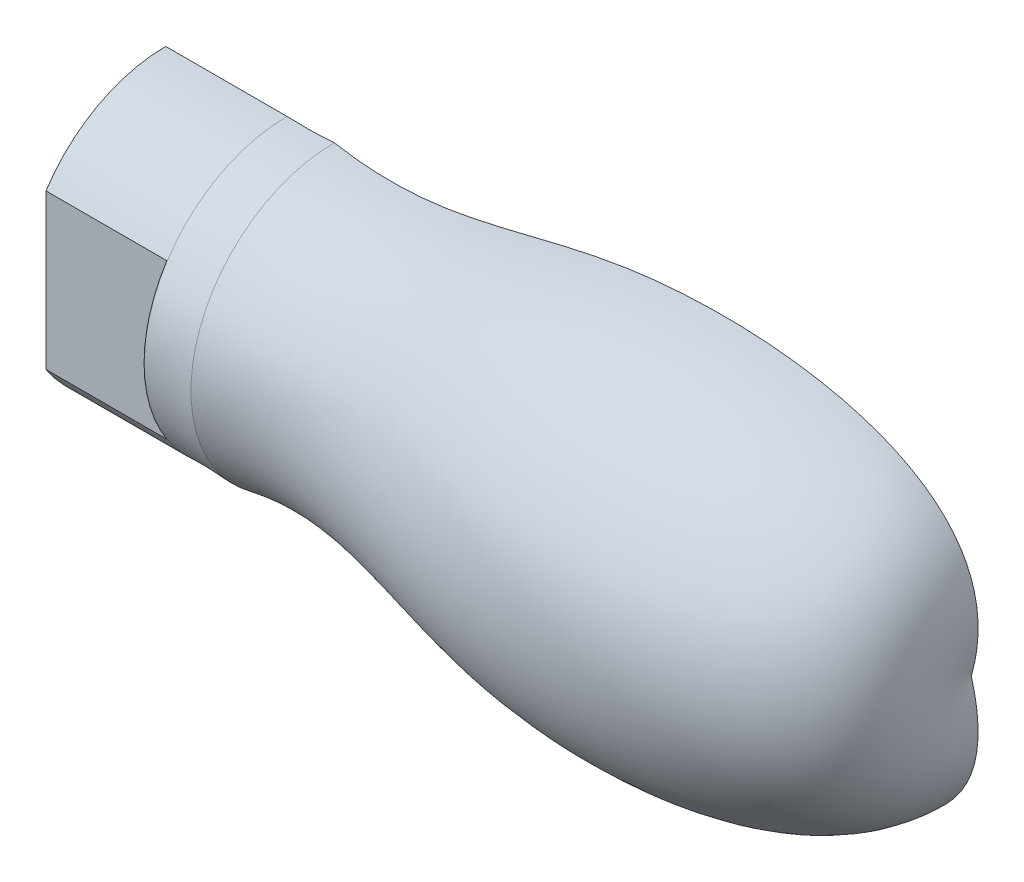
ISO-10303-21;
HEADER;
FILE_DESCRIPTION(('STEP AP214'),'2;1');
FILE_NAME('part.step','',(''),(''),'','','');
FILE_SCHEMA(('AUTOMOTIVE_DESIGN { 1 0 10303 214 1 1 1 1 }'));
ENDSEC;
DATA;
#1=APPLICATION_CONTEXT('core data for automotive mechanical design processes');
#2=APPLICATION_PROTOCOL_DEFINITION('international standard','automotive_design',2000,#1);
#3=PRODUCT_CONTEXT('',#1,'mechanical');
#4=PRODUCT('Part','Part','',(#3));
#5=PRODUCT_RELATED_PRODUCT_CATEGORY('part','',(#4));
#6=PRODUCT_DEFINITION_FORMATION('','',#4);
#7=PRODUCT_DEFINITION_CONTEXT('part definition',#1,'design');
#8=PRODUCT_DEFINITION('design','',#6,#7);
#9=PRODUCT_DEFINITION_SHAPE('','',#8);
#10=(LENGTH_UNIT() NAMED_UNIT(*) SI_UNIT(.MILLI.,.METRE.));
#11=(NAMED_UNIT(*) PLANE_ANGLE_UNIT() SI_UNIT($,.RADIAN.));
#12=(NAMED_UNIT(*) SI_UNIT($,.STERADIAN.) SOLID_ANGLE_UNIT());
#13=UNCERTAINTY_MEASURE_WITH_UNIT(LENGTH_MEASURE(1.E-05),#10,'distance_accuracy_value','');
#14=(GEOMETRIC_REPRESENTATION_CONTEXT(3) GLOBAL_UNCERTAINTY_ASSIGNED_CONTEXT((#13)) GLOBAL_UNIT_ASSIGNED_CONTEXT((#10,
#11,#12)) REPRESENTATION_CONTEXT('',''));
#15=CARTESIAN_POINT('',(0.,0.,0.));
#16=DIRECTION('',(0.,0.,1.));
#17=DIRECTION('',(1.,0.,0.));
#18=AXIS2_PLACEMENT_3D('',#15,#16,#17);
#19=CARTESIAN_POINT('',(-0.0219371371269837,-0.0222773179981183,-0.0199999995529652));
#20=CARTESIAN_POINT('',(-0.0181835933509417,-0.0221070063690019,-0.0199999995529652));
#21=CARTESIAN_POINT('',(-0.0145440964927969,-0.0224081073792718,-0.0199999995529652));
#22=B_SPLINE_CURVE_WITH_KNOTS('',2,(#19,#20,#21),.UNSPECIFIED.,.F.,.F.,(3,3),(0.,
0.0744065206796112),.UNSPECIFIED.);
#23=CARTESIAN_POINT('',(-0.0408828464639241,0.,-0.0199999995529652));
#24=DIRECTION('',(-1.,0.,0.));
#25=AXIS1_PLACEMENT('',#23,#24);
#26=SURFACE_OF_REVOLUTION('',#22,#25);
#27=CARTESIAN_POINT('',(-0.0145440964927969,0.,-0.0199999995529652));
#28=DIRECTION('',(-1.,0.,0.));
#29=DIRECTION('',(0.,0.,1.));
#30=AXIS2_PLACEMENT_3D('',#27,#28,#29);
#31=CIRCLE('',#30,0.0224081073792718);
#32=CARTESIAN_POINT('',(-0.0145440964927969,-0.0224081073792718,-0.0199999995529652));
#33=VERTEX_POINT('',#32);
#34=CARTESIAN_POINT('',(-0.0145440964927969,0.0224081073792718,-0.0199999995529652));
#35=VERTEX_POINT('',#34);
#36=EDGE_CURVE('E95',#33,#35,#31,.T.);
#37=ORIENTED_EDGE('',*,*,#36,.T.);
#38=CARTESIAN_POINT('',(-0.0219371371269837,0.0222773179981183,-0.0199999995529652));
#39=CARTESIAN_POINT('',(-0.0181835933509417,0.0221070063690019,-0.0199999995529652));
#40=CARTESIAN_POINT('',(-0.0145440964927969,0.0224081073792718,-0.0199999995529652));
#41=B_SPLINE_CURVE_WITH_KNOTS('',2,(#38,#39,#40),.UNSPECIFIED.,.F.,.F.,(3,3),(0.,
0.0744065206796112),.UNSPECIFIED.);
#42=CARTESIAN_POINT('',(-0.0219371371269837,0.0222773179981183,-0.0199999995529652));
#43=VERTEX_POINT('',#42);
#44=EDGE_CURVE('E161',#43,#35,#41,.T.);
#45=ORIENTED_EDGE('',*,*,#44,.F.);
#46=CARTESIAN_POINT('',(-0.0219371371269837,0.,-0.0199999995529652));
#47=DIRECTION('',(-1.,0.,0.));
#48=DIRECTION('',(0.,0.,1.));
#49=AXIS2_PLACEMENT_3D('',#46,#47,#48);
#50=CIRCLE('',#49,0.0222773179981183);
#51=CARTESIAN_POINT('',(-0.0219371371269837,-0.0222773179981183,-0.0199999995529652));
#52=VERTEX_POINT('',#51);
#53=EDGE_CURVE('E62',#52,#43,#50,.T.);
#54=ORIENTED_EDGE('',*,*,#53,.F.);
#55=EDGE_CURVE('E131',#52,#33,#22,.T.);
#56=ORIENTED_EDGE('',*,*,#55,.T.);
#57=EDGE_LOOP('',(#37,#45,#54,#56));
#58=FACE_BOUND('',#57,.T.);
#59=ADVANCED_FACE('F39',(#58),#26,.F.);
#60=CARTESIAN_POINT('',(-0.0145440964927969,-0.0224081073792718,-0.0199999995529652));
#61=CARTESIAN_POINT('',(0.00247091074699529,-0.0193367149228004,-0.0199999995529652));
#62=CARTESIAN_POINT('',(0.0322886425798856,-0.0355059717333231,-0.0199999995529653));
#63=CARTESIAN_POINT('',(0.0927020413644303,-0.0268647789069709,-0.0199999995529653));
#64=CARTESIAN_POINT('',(0.0849876443539925,0.,-0.0199999995529652));
#65=B_SPLINE_CURVE_WITH_KNOTS('',3,(#60,#61,#62,#63,#64),.UNSPECIFIED.,.F.,.F.,(4,1,4),(0.,
0.406683359526598,1.),.UNSPECIFIED.);
#66=CARTESIAN_POINT('',(-0.0408828464639241,0.,-0.0199999995529652));
#67=DIRECTION('',(-1.,0.,0.));
#68=AXIS1_PLACEMENT('',#66,#67);
#69=SURFACE_OF_REVOLUTION('',#65,#68);
#70=CARTESIAN_POINT('',(-0.0145440964927969,0.0224081073792718,-0.0199999995529652));
#71=CARTESIAN_POINT('',(0.00247091074699529,0.0193367149228004,-0.0199999995529652));
#72=CARTESIAN_POINT('',(0.0322886425798856,0.0355059717333231,-0.0199999995529653));
#73=CARTESIAN_POINT('',(0.0927020413644303,0.0268647789069709,-0.0199999995529653));
#74=CARTESIAN_POINT('',(0.0849876443539925,0.,-0.0199999995529652));
#75=B_SPLINE_CURVE_WITH_KNOTS('',3,(#70,#71,#72,#73,#74),.UNSPECIFIED.,.F.,.F.,(4,1,4),(0.,
0.406683359526598,1.),.UNSPECIFIED.);
#76=CARTESIAN_POINT('',(0.0849876443539925,0.,-0.0199999995529652));
#77=VERTEX_POINT('',#76);
#78=EDGE_CURVE('E165',#35,#77,#75,.T.);
#79=ORIENTED_EDGE('',*,*,#78,.F.);
#80=ORIENTED_EDGE('',*,*,#36,.F.);
#81=EDGE_CURVE('E124',#33,#77,#65,.T.);
#82=ORIENTED_EDGE('',*,*,#81,.T.);
#83=EDGE_LOOP('',(#79,#80,#82));
#84=FACE_BOUND('',#83,.T.);
#85=ADVANCED_FACE('F41',(#84),#69,.F.);
#86=CARTESIAN_POINT('',(-0.0408828464639241,-0.0222773179981183,-0.0199999995529652));
#87=DIRECTION('',(-1.,0.,0.));
#88=DIRECTION('',(0.,0.,1.));
#89=AXIS2_PLACEMENT_3D('',#86,#87,#88);
#90=PLANE('',#89);
#91=DIRECTION('',(0.,-1.,0.));
#92=VECTOR('',#91,1.);
#93=CARTESIAN_POINT('',(-0.0408828464639241,-0.0222773179981183,-0.00128299731931941));
#94=LINE('',#93,#92);
#95=CARTESIAN_POINT('',(-0.0408828464639241,0.0120810895442003,-0.00128299731931941));
#96=VERTEX_POINT('',#95);
#97=CARTESIAN_POINT('',(-0.0408828464639241,-0.0120810895442003,-0.00128299731931941));
#98=VERTEX_POINT('',#97);
#99=EDGE_CURVE('E101',#96,#98,#94,.T.);
#100=ORIENTED_EDGE('',*,*,#99,.F.);
#101=CARTESIAN_POINT('',(-0.0408828464639241,0.,-0.0199999995529652));
#102=DIRECTION('',(-1.,0.,0.));
#103=DIRECTION('',(0.,0.,1.));
#104=AXIS2_PLACEMENT_3D('',#101,#102,#103);
#105=CIRCLE('',#104,0.0222773179981183);
#106=CARTESIAN_POINT('',(-0.0408828464639241,0.0222773179981183,-0.0199999995529652));
#107=VERTEX_POINT('',#106);
#108=EDGE_CURVE('E106',#96,#107,#105,.T.);
#109=ORIENTED_EDGE('',*,*,#108,.T.);
#110=DIRECTION('',(0.,-1.,0.));
#111=VECTOR('',#110,1.);
#112=CARTESIAN_POINT('',(-0.0408828464639241,-0.0222773179981183,-0.0199999995529652));
#113=LINE('',#112,#111);
#114=CARTESIAN_POINT('',(-0.0408828464639241,-0.0222773179981183,-0.0199999995529652));
#115=VERTEX_POINT('',#114);
#116=EDGE_CURVE('E121',#107,#115,#113,.T.);
#117=ORIENTED_EDGE('',*,*,#116,.T.);
#118=EDGE_CURVE('E111',#115,#98,#105,.T.);
#119=ORIENTED_EDGE('',*,*,#118,.T.);
#120=EDGE_LOOP('',(#100,#109,#117,#119));
#121=FACE_BOUND('',#120,.T.);
#122=ADVANCED_FACE('F152',(#121),#90,.T.);
#123=CARTESIAN_POINT('',(-0.0408828464639241,0.,-0.0199999995529652));
#124=DIRECTION('',(-1.,0.,0.));
#125=DIRECTION('',(0.,0.,1.));
#126=AXIS2_PLACEMENT_3D('',#123,#124,#125);
#127=CYLINDRICAL_SURFACE('',#126,0.0222773179981183);
#128=DIRECTION('',(-1.,0.,0.));
#129=VECTOR('',#128,1.);
#130=CARTESIAN_POINT('',(-0.0408828464639241,-0.0120810895442003,-0.00128299731931941));
#131=LINE('',#130,#129);
#132=CARTESIAN_POINT('',(-0.022,-0.0120810895442003,-0.00128299731931941));
#133=VERTEX_POINT('',#132);
#134=EDGE_CURVE('E11',#98,#133,#131,.F.);
#135=ORIENTED_EDGE('',*,*,#134,.F.);
#136=ORIENTED_EDGE('',*,*,#118,.F.);
#137=DIRECTION('',(1.,0.,0.));
#138=VECTOR('',#137,1.);
#139=CARTESIAN_POINT('',(-0.0408828464639241,-0.0222773179981183,-0.0199999995529652));
#140=LINE('',#139,#138);
#141=EDGE_CURVE('E117',#115,#52,#140,.T.);
#142=ORIENTED_EDGE('',*,*,#141,.T.);
#143=ORIENTED_EDGE('',*,*,#53,.T.);
#144=DIRECTION('',(1.,0.,0.));
#145=VECTOR('',#144,1.);
#146=CARTESIAN_POINT('',(-0.0408828464639241,0.0222773179981183,-0.0199999995529652));
#147=LINE('',#146,#145);
#148=EDGE_CURVE('E140',#107,#43,#147,.T.);
#149=ORIENTED_EDGE('',*,*,#148,.F.);
#150=ORIENTED_EDGE('',*,*,#108,.F.);
#151=DIRECTION('',(-1.,0.,0.));
#152=VECTOR('',#151,1.);
#153=CARTESIAN_POINT('',(-0.0408828464639241,0.0120810895442003,-0.00128299731931941));
#154=LINE('',#153,#152);
#155=CARTESIAN_POINT('',(-0.022,0.0120810895442003,-0.00128299731931941));
#156=VERTEX_POINT('',#155);
#157=EDGE_CURVE('E49',#156,#96,#154,.T.);
#158=ORIENTED_EDGE('',*,*,#157,.F.);
#159=CARTESIAN_POINT('',(-0.022,0.,-0.0199999995529652));
#160=DIRECTION('',(1.,0.,0.));
#161=DIRECTION('',(0.,0.,-1.));
#162=AXIS2_PLACEMENT_3D('',#159,#160,#161);
#163=CIRCLE('',#162,0.0222773179981183);
#164=EDGE_CURVE('E89',#133,#156,#163,.F.);
#165=ORIENTED_EDGE('',*,*,#164,.F.);
#166=EDGE_LOOP('',(#135,#136,#142,#143,#149,#150,#158,#165));
#167=FACE_BOUND('',#166,.T.);
#168=ADVANCED_FACE('F104',(#167),#127,.T.);
#169=CARTESIAN_POINT('',(-0.018212105080416,-0.0222248595288485,-0.0199999995529652));
#170=DIRECTION('',(0.,0.,1.));
#171=DIRECTION('',(0.,-1.,0.));
#172=AXIS2_PLACEMENT_3D('',#169,#170,#171);
#173=PLANE('',#172);
#174=ORIENTED_EDGE('',*,*,#55,.F.);
#175=ORIENTED_EDGE('',*,*,#141,.F.);
#176=ORIENTED_EDGE('',*,*,#116,.F.);
#177=ORIENTED_EDGE('',*,*,#148,.T.);
#178=ORIENTED_EDGE('',*,*,#44,.T.);
#179=ORIENTED_EDGE('',*,*,#78,.T.);
#180=ORIENTED_EDGE('',*,*,#81,.F.);
#181=EDGE_LOOP('',(#174,#175,#176,#177,#178,#179,#180));
#182=FACE_BOUND('',#181,.T.);
#183=ADVANCED_FACE('F149',(#182),#173,.F.);
#184=CARTESIAN_POINT('',(-10.022,0.0169213399385725,-0.00128299731931941));
#185=DIRECTION('',(0.,0.,-1.));
#186=DIRECTION('',(-1.,0.,0.));
#187=AXIS2_PLACEMENT_3D('',#184,#185,#186);
#188=PLANE('',#187);
#189=ORIENTED_EDGE('',*,*,#134,.T.);
#190=DIRECTION('',(0.,1.,0.));
#191=VECTOR('',#190,1.);
#192=CARTESIAN_POINT('',(-0.022,0.0169213399385725,-0.00128299731931941));
#193=LINE('',#192,#191);
#194=EDGE_CURVE('E55',#133,#156,#193,.T.);
#195=ORIENTED_EDGE('',*,*,#194,.T.);
#196=ORIENTED_EDGE('',*,*,#157,.T.);
#197=ORIENTED_EDGE('',*,*,#99,.T.);
#198=EDGE_LOOP('',(#189,#195,#196,#197));
#199=FACE_BOUND('',#198,.T.);
#200=ADVANCED_FACE('F98',(#199),#188,.F.);
#201=CARTESIAN_POINT('',(-0.022,0.,0.));
#202=DIRECTION('',(1.,0.,0.));
#203=DIRECTION('',(0.,0.,-1.));
#204=AXIS2_PLACEMENT_3D('',#201,#202,#203);
#205=PLANE('',#204);
#206=ORIENTED_EDGE('',*,*,#164,.T.);
#207=ORIENTED_EDGE('',*,*,#194,.F.);
#208=EDGE_LOOP('',(#206,#207));
#209=FACE_BOUND('',#208,.T.);
#210=ADVANCED_FACE('F90',(#209),#205,.F.);
#211=CLOSED_SHELL('',(#59,#85,#122,#168,#183,#200,#210));
#212=MANIFOLD_SOLID_BREP('B2',#211);
#213=ADVANCED_BREP_SHAPE_REPRESENTATION('',(#18,#212),#14);
#214=SHAPE_DEFINITION_REPRESENTATION(#9,#213);
ENDSEC;
END-ISO-10303-21;
